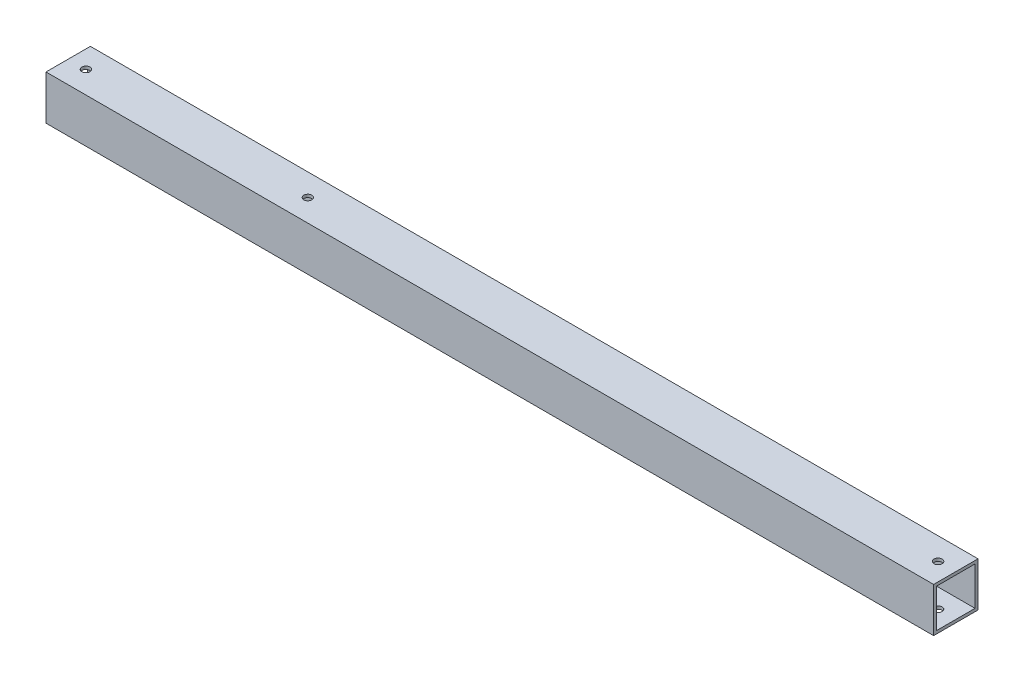
ISO-10303-21;
HEADER;
FILE_DESCRIPTION(('STEP AP214'),'2;1');
FILE_NAME('part.step','',(''),(''),'','','');
FILE_SCHEMA(('AUTOMOTIVE_DESIGN { 1 0 10303 214 1 1 1 1 }'));
ENDSEC;
DATA;
#1=APPLICATION_CONTEXT('core data for automotive mechanical design processes');
#2=APPLICATION_PROTOCOL_DEFINITION('international standard','automotive_design',2000,#1);
#3=PRODUCT_CONTEXT('',#1,'mechanical');
#4=PRODUCT('Part','Part','',(#3));
#5=PRODUCT_RELATED_PRODUCT_CATEGORY('part','',(#4));
#6=PRODUCT_DEFINITION_FORMATION('','',#4);
#7=PRODUCT_DEFINITION_CONTEXT('part definition',#1,'design');
#8=PRODUCT_DEFINITION('design','',#6,#7);
#9=PRODUCT_DEFINITION_SHAPE('','',#8);
#10=(LENGTH_UNIT() NAMED_UNIT(*) SI_UNIT(.MILLI.,.METRE.));
#11=(NAMED_UNIT(*) PLANE_ANGLE_UNIT() SI_UNIT($,.RADIAN.));
#12=(NAMED_UNIT(*) SI_UNIT($,.STERADIAN.) SOLID_ANGLE_UNIT());
#13=UNCERTAINTY_MEASURE_WITH_UNIT(LENGTH_MEASURE(1.E-05),#10,'distance_accuracy_value','');
#14=(GEOMETRIC_REPRESENTATION_CONTEXT(3) GLOBAL_UNCERTAINTY_ASSIGNED_CONTEXT((#13)) GLOBAL_UNIT_ASSIGNED_CONTEXT((#10,
#11,#12)) REPRESENTATION_CONTEXT('',''));
#15=CARTESIAN_POINT('',(0.,0.,0.));
#16=DIRECTION('',(0.,0.,1.));
#17=DIRECTION('',(1.,0.,0.));
#18=AXIS2_PLACEMENT_3D('',#15,#16,#17);
#19=CARTESIAN_POINT('',(300.,0.,0.));
#20=DIRECTION('',(-1.,0.,0.));
#21=DIRECTION('',(0.,0.,1.));
#22=AXIS2_PLACEMENT_3D('',#19,#20,#21);
#23=PLANE('',#22);
#24=DIRECTION('',(0.,-1.,0.));
#25=VECTOR('',#24,1.);
#26=CARTESIAN_POINT('',(300.,15.,15.));
#27=LINE('',#26,#25);
#28=CARTESIAN_POINT('',(300.,15.,15.));
#29=VERTEX_POINT('',#28);
#30=CARTESIAN_POINT('',(300.,-15.,15.));
#31=VERTEX_POINT('',#30);
#32=EDGE_CURVE('E157',#29,#31,#27,.T.);
#33=ORIENTED_EDGE('',*,*,#32,.T.);
#34=DIRECTION('',(0.,0.,-1.));
#35=VECTOR('',#34,1.);
#36=CARTESIAN_POINT('',(300.,-15.,-15.));
#37=LINE('',#36,#35);
#38=CARTESIAN_POINT('',(300.,-15.,-15.));
#39=VERTEX_POINT('',#38);
#40=EDGE_CURVE('E161',#31,#39,#37,.T.);
#41=ORIENTED_EDGE('',*,*,#40,.T.);
#42=DIRECTION('',(0.,1.,0.));
#43=VECTOR('',#42,1.);
#44=CARTESIAN_POINT('',(300.,15.,-15.));
#45=LINE('',#44,#43);
#46=CARTESIAN_POINT('',(300.,15.,-15.));
#47=VERTEX_POINT('',#46);
#48=EDGE_CURVE('E165',#39,#47,#45,.T.);
#49=ORIENTED_EDGE('',*,*,#48,.T.);
#50=DIRECTION('',(0.,0.,1.));
#51=VECTOR('',#50,1.);
#52=CARTESIAN_POINT('',(300.,15.,-15.));
#53=LINE('',#52,#51);
#54=EDGE_CURVE('E168',#47,#29,#53,.T.);
#55=ORIENTED_EDGE('',*,*,#54,.T.);
#56=EDGE_LOOP('',(#33,#41,#49,#55));
#57=FACE_BOUND('',#56,.T.);
#58=DIRECTION('',(0.,1.,0.));
#59=VECTOR('',#58,1.);
#60=CARTESIAN_POINT('',(300.,13.,-13.));
#61=LINE('',#60,#59);
#62=CARTESIAN_POINT('',(300.,-13.,-13.));
#63=VERTEX_POINT('',#62);
#64=CARTESIAN_POINT('',(300.,13.,-13.));
#65=VERTEX_POINT('',#64);
#66=EDGE_CURVE('E107',#63,#65,#61,.T.);
#67=ORIENTED_EDGE('',*,*,#66,.F.);
#68=DIRECTION('',(0.,0.,-1.));
#69=VECTOR('',#68,1.);
#70=CARTESIAN_POINT('',(300.,-13.,13.));
#71=LINE('',#70,#69);
#72=CARTESIAN_POINT('',(300.,-13.,13.));
#73=VERTEX_POINT('',#72);
#74=EDGE_CURVE('E133',#73,#63,#71,.T.);
#75=ORIENTED_EDGE('',*,*,#74,.F.);
#76=DIRECTION('',(0.,-1.,0.));
#77=VECTOR('',#76,1.);
#78=CARTESIAN_POINT('',(300.,13.,13.));
#79=LINE('',#78,#77);
#80=CARTESIAN_POINT('',(300.,13.,13.));
#81=VERTEX_POINT('',#80);
#82=EDGE_CURVE('E129',#81,#73,#79,.T.);
#83=ORIENTED_EDGE('',*,*,#82,.F.);
#84=DIRECTION('',(0.,0.,1.));
#85=VECTOR('',#84,1.);
#86=CARTESIAN_POINT('',(300.,13.,13.));
#87=LINE('',#86,#85);
#88=EDGE_CURVE('E116',#65,#81,#87,.T.);
#89=ORIENTED_EDGE('',*,*,#88,.F.);
#90=EDGE_LOOP('',(#67,#75,#83,#89));
#91=FACE_BOUND('',#90,.T.);
#92=ADVANCED_FACE('F39',(#57,#91),#23,.F.);
#93=CARTESIAN_POINT('',(-300.,0.,0.));
#94=DIRECTION('',(-1.,0.,0.));
#95=DIRECTION('',(0.,0.,1.));
#96=AXIS2_PLACEMENT_3D('',#93,#94,#95);
#97=PLANE('',#96);
#98=DIRECTION('',(0.,-1.,0.));
#99=VECTOR('',#98,1.);
#100=CARTESIAN_POINT('',(-300.,15.,15.));
#101=LINE('',#100,#99);
#102=CARTESIAN_POINT('',(-300.,15.,15.));
#103=VERTEX_POINT('',#102);
#104=CARTESIAN_POINT('',(-300.,-15.,15.));
#105=VERTEX_POINT('',#104);
#106=EDGE_CURVE('E125',#103,#105,#101,.T.);
#107=ORIENTED_EDGE('',*,*,#106,.F.);
#108=DIRECTION('',(0.,0.,1.));
#109=VECTOR('',#108,1.);
#110=CARTESIAN_POINT('',(-300.,15.,-15.));
#111=LINE('',#110,#109);
#112=CARTESIAN_POINT('',(-300.,15.,-15.));
#113=VERTEX_POINT('',#112);
#114=EDGE_CURVE('E162',#113,#103,#111,.T.);
#115=ORIENTED_EDGE('',*,*,#114,.F.);
#116=DIRECTION('',(0.,1.,0.));
#117=VECTOR('',#116,1.);
#118=CARTESIAN_POINT('',(-300.,15.,-15.));
#119=LINE('',#118,#117);
#120=CARTESIAN_POINT('',(-300.,-15.,-15.));
#121=VERTEX_POINT('',#120);
#122=EDGE_CURVE('E178',#121,#113,#119,.T.);
#123=ORIENTED_EDGE('',*,*,#122,.F.);
#124=DIRECTION('',(0.,0.,-1.));
#125=VECTOR('',#124,1.);
#126=CARTESIAN_POINT('',(-300.,-15.,-15.));
#127=LINE('',#126,#125);
#128=EDGE_CURVE('E175',#105,#121,#127,.T.);
#129=ORIENTED_EDGE('',*,*,#128,.F.);
#130=EDGE_LOOP('',(#107,#115,#123,#129));
#131=FACE_BOUND('',#130,.T.);
#132=DIRECTION('',(0.,0.,-1.));
#133=VECTOR('',#132,1.);
#134=CARTESIAN_POINT('',(-300.,-13.,13.));
#135=LINE('',#134,#133);
#136=CARTESIAN_POINT('',(-300.,-13.,13.));
#137=VERTEX_POINT('',#136);
#138=CARTESIAN_POINT('',(-300.,-13.,-13.));
#139=VERTEX_POINT('',#138);
#140=EDGE_CURVE('E117',#137,#139,#135,.T.);
#141=ORIENTED_EDGE('',*,*,#140,.T.);
#142=DIRECTION('',(0.,1.,0.));
#143=VECTOR('',#142,1.);
#144=CARTESIAN_POINT('',(-300.,13.,-13.));
#145=LINE('',#144,#143);
#146=CARTESIAN_POINT('',(-300.,13.,-13.));
#147=VERTEX_POINT('',#146);
#148=EDGE_CURVE('E65',#139,#147,#145,.T.);
#149=ORIENTED_EDGE('',*,*,#148,.T.);
#150=DIRECTION('',(0.,0.,1.));
#151=VECTOR('',#150,1.);
#152=CARTESIAN_POINT('',(-300.,13.,13.));
#153=LINE('',#152,#151);
#154=CARTESIAN_POINT('',(-300.,13.,13.));
#155=VERTEX_POINT('',#154);
#156=EDGE_CURVE('E123',#147,#155,#153,.T.);
#157=ORIENTED_EDGE('',*,*,#156,.T.);
#158=DIRECTION('',(0.,-1.,0.));
#159=VECTOR('',#158,1.);
#160=CARTESIAN_POINT('',(-300.,13.,13.));
#161=LINE('',#160,#159);
#162=EDGE_CURVE('E144',#155,#137,#161,.T.);
#163=ORIENTED_EDGE('',*,*,#162,.T.);
#164=EDGE_LOOP('',(#141,#149,#157,#163));
#165=FACE_BOUND('',#164,.T.);
#166=ADVANCED_FACE('F248',(#131,#165),#97,.T.);
#167=CARTESIAN_POINT('',(300.,15.,15.));
#168=DIRECTION('',(0.,0.,-1.));
#169=DIRECTION('',(0.,1.,0.));
#170=AXIS2_PLACEMENT_3D('',#167,#168,#169);
#171=PLANE('',#170);
#172=ORIENTED_EDGE('',*,*,#106,.T.);
#173=DIRECTION('',(-1.,0.,0.));
#174=VECTOR('',#173,1.);
#175=CARTESIAN_POINT('',(300.,-15.,15.));
#176=LINE('',#175,#174);
#177=EDGE_CURVE('E11',#31,#105,#176,.T.);
#178=ORIENTED_EDGE('',*,*,#177,.F.);
#179=ORIENTED_EDGE('',*,*,#32,.F.);
#180=DIRECTION('',(-1.,0.,0.));
#181=VECTOR('',#180,1.);
#182=CARTESIAN_POINT('',(300.,15.,15.));
#183=LINE('',#182,#181);
#184=EDGE_CURVE('E171',#29,#103,#183,.T.);
#185=ORIENTED_EDGE('',*,*,#184,.T.);
#186=EDGE_LOOP('',(#172,#178,#179,#185));
#187=FACE_BOUND('',#186,.T.);
#188=ADVANCED_FACE('F41',(#187),#171,.F.);
#189=CARTESIAN_POINT('',(300.,-15.,-15.));
#190=DIRECTION('',(0.,1.,0.));
#191=DIRECTION('',(0.,0.,1.));
#192=AXIS2_PLACEMENT_3D('',#189,#190,#191);
#193=PLANE('',#192);
#194=CARTESIAN_POINT('',(-138.,-15.,0.));
#195=DIRECTION('',(0.,1.,0.));
#196=DIRECTION('',(0.,0.,1.));
#197=AXIS2_PLACEMENT_3D('',#194,#195,#196);
#198=CIRCLE('',#197,2.75000000000001);
#199=CARTESIAN_POINT('',(-138.,-15.,2.75000000000001));
#200=VERTEX_POINT('',#199);
#201=EDGE_CURVE('E273',#200,#200,#198,.T.);
#202=ORIENTED_EDGE('',*,*,#201,.T.);
#203=EDGE_LOOP('',(#202));
#204=FACE_BOUND('',#203,.T.);
#205=CARTESIAN_POINT('',(-288.,-15.,0.));
#206=DIRECTION('',(0.,-1.,0.));
#207=DIRECTION('',(0.,0.,1.));
#208=AXIS2_PLACEMENT_3D('',#205,#206,#207);
#209=CIRCLE('',#208,2.75000000000004);
#210=CARTESIAN_POINT('',(-288.,-15.,2.75000000000004));
#211=VERTEX_POINT('',#210);
#212=EDGE_CURVE('E201',#211,#211,#209,.T.);
#213=ORIENTED_EDGE('',*,*,#212,.F.);
#214=EDGE_LOOP('',(#213));
#215=FACE_BOUND('',#214,.T.);
#216=CARTESIAN_POINT('',(288.,-15.,0.));
#217=DIRECTION('',(0.,1.,0.));
#218=DIRECTION('',(0.,0.,1.));
#219=AXIS2_PLACEMENT_3D('',#216,#217,#218);
#220=CIRCLE('',#219,2.75000000000004);
#221=CARTESIAN_POINT('',(288.,-15.,2.75000000000004));
#222=VERTEX_POINT('',#221);
#223=EDGE_CURVE('E196',#222,#222,#220,.T.);
#224=ORIENTED_EDGE('',*,*,#223,.T.);
#225=EDGE_LOOP('',(#224));
#226=FACE_BOUND('',#225,.T.);
#227=ORIENTED_EDGE('',*,*,#128,.T.);
#228=DIRECTION('',(-1.,0.,0.));
#229=VECTOR('',#228,1.);
#230=CARTESIAN_POINT('',(300.,-15.,-15.));
#231=LINE('',#230,#229);
#232=EDGE_CURVE('E49',#39,#121,#231,.T.);
#233=ORIENTED_EDGE('',*,*,#232,.F.);
#234=ORIENTED_EDGE('',*,*,#40,.F.);
#235=ORIENTED_EDGE('',*,*,#177,.T.);
#236=EDGE_LOOP('',(#227,#233,#234,#235));
#237=FACE_BOUND('',#236,.T.);
#238=ADVANCED_FACE('F262',(#204,#215,#226,#237),#193,.F.);
#239=CARTESIAN_POINT('',(300.,15.,-15.));
#240=DIRECTION('',(0.,0.,1.));
#241=DIRECTION('',(0.,-1.,0.));
#242=AXIS2_PLACEMENT_3D('',#239,#240,#241);
#243=PLANE('',#242);
#244=ORIENTED_EDGE('',*,*,#122,.T.);
#245=DIRECTION('',(-1.,0.,0.));
#246=VECTOR('',#245,1.);
#247=CARTESIAN_POINT('',(300.,15.,-15.));
#248=LINE('',#247,#246);
#249=EDGE_CURVE('E186',#47,#113,#248,.T.);
#250=ORIENTED_EDGE('',*,*,#249,.F.);
#251=ORIENTED_EDGE('',*,*,#48,.F.);
#252=ORIENTED_EDGE('',*,*,#232,.T.);
#253=EDGE_LOOP('',(#244,#250,#251,#252));
#254=FACE_BOUND('',#253,.T.);
#255=ADVANCED_FACE('F259',(#254),#243,.F.);
#256=CARTESIAN_POINT('',(300.,15.,-15.));
#257=DIRECTION('',(0.,-1.,0.));
#258=DIRECTION('',(0.,0.,-1.));
#259=AXIS2_PLACEMENT_3D('',#256,#257,#258);
#260=PLANE('',#259);
#261=CARTESIAN_POINT('',(-138.,15.,0.));
#262=DIRECTION('',(0.,1.,0.));
#263=DIRECTION('',(0.,0.,1.));
#264=AXIS2_PLACEMENT_3D('',#261,#262,#263);
#265=CIRCLE('',#264,2.75000000000001);
#266=CARTESIAN_POINT('',(-138.,15.,2.75000000000001));
#267=VERTEX_POINT('',#266);
#268=EDGE_CURVE('E319',#267,#267,#265,.T.);
#269=ORIENTED_EDGE('',*,*,#268,.F.);
#270=EDGE_LOOP('',(#269));
#271=FACE_BOUND('',#270,.T.);
#272=CARTESIAN_POINT('',(-288.,15.,0.));
#273=DIRECTION('',(0.,-1.,0.));
#274=DIRECTION('',(0.,0.,1.));
#275=AXIS2_PLACEMENT_3D('',#272,#273,#274);
#276=CIRCLE('',#275,2.75000000000004);
#277=CARTESIAN_POINT('',(-288.,15.,2.75000000000004));
#278=VERTEX_POINT('',#277);
#279=EDGE_CURVE('E210',#278,#278,#276,.T.);
#280=ORIENTED_EDGE('',*,*,#279,.T.);
#281=EDGE_LOOP('',(#280));
#282=FACE_BOUND('',#281,.T.);
#283=CARTESIAN_POINT('',(288.,15.,0.));
#284=DIRECTION('',(0.,1.,0.));
#285=DIRECTION('',(0.,0.,1.));
#286=AXIS2_PLACEMENT_3D('',#283,#284,#285);
#287=CIRCLE('',#286,2.75000000000004);
#288=CARTESIAN_POINT('',(288.,15.,2.75000000000004));
#289=VERTEX_POINT('',#288);
#290=EDGE_CURVE('E207',#289,#289,#287,.T.);
#291=ORIENTED_EDGE('',*,*,#290,.F.);
#292=EDGE_LOOP('',(#291));
#293=FACE_BOUND('',#292,.T.);
#294=ORIENTED_EDGE('',*,*,#114,.T.);
#295=ORIENTED_EDGE('',*,*,#184,.F.);
#296=ORIENTED_EDGE('',*,*,#54,.F.);
#297=ORIENTED_EDGE('',*,*,#249,.T.);
#298=EDGE_LOOP('',(#294,#295,#296,#297));
#299=FACE_BOUND('',#298,.T.);
#300=ADVANCED_FACE('F243',(#271,#282,#293,#299),#260,.F.);
#301=CARTESIAN_POINT('',(300.,13.,-13.));
#302=DIRECTION('',(0.,0.,1.));
#303=DIRECTION('',(1.,0.,0.));
#304=AXIS2_PLACEMENT_3D('',#301,#302,#303);
#305=PLANE('',#304);
#306=ORIENTED_EDGE('',*,*,#148,.F.);
#307=DIRECTION('',(-1.,0.,0.));
#308=VECTOR('',#307,1.);
#309=CARTESIAN_POINT('',(300.,-13.,-13.));
#310=LINE('',#309,#308);
#311=EDGE_CURVE('E111',#63,#139,#310,.T.);
#312=ORIENTED_EDGE('',*,*,#311,.F.);
#313=ORIENTED_EDGE('',*,*,#66,.T.);
#314=DIRECTION('',(-1.,0.,0.));
#315=VECTOR('',#314,1.);
#316=CARTESIAN_POINT('',(300.,13.,-13.));
#317=LINE('',#316,#315);
#318=EDGE_CURVE('E110',#65,#147,#317,.T.);
#319=ORIENTED_EDGE('',*,*,#318,.T.);
#320=EDGE_LOOP('',(#306,#312,#313,#319));
#321=FACE_BOUND('',#320,.T.);
#322=ADVANCED_FACE('F109',(#321),#305,.T.);
#323=CARTESIAN_POINT('',(300.,13.,13.));
#324=DIRECTION('',(0.,-1.,0.));
#325=DIRECTION('',(0.,0.,-1.));
#326=AXIS2_PLACEMENT_3D('',#323,#324,#325);
#327=PLANE('',#326);
#328=CARTESIAN_POINT('',(-138.,13.,0.));
#329=DIRECTION('',(0.,-1.,0.));
#330=DIRECTION('',(0.,0.,-1.));
#331=AXIS2_PLACEMENT_3D('',#328,#329,#330);
#332=CIRCLE('',#331,2.75000000000001);
#333=CARTESIAN_POINT('',(-138.,13.,-2.75000000000001));
#334=VERTEX_POINT('',#333);
#335=EDGE_CURVE('E216',#334,#334,#332,.T.);
#336=ORIENTED_EDGE('',*,*,#335,.F.);
#337=EDGE_LOOP('',(#336));
#338=FACE_BOUND('',#337,.T.);
#339=CARTESIAN_POINT('',(-288.,13.,0.));
#340=DIRECTION('',(0.,-1.,0.));
#341=DIRECTION('',(0.,0.,-1.));
#342=AXIS2_PLACEMENT_3D('',#339,#340,#341);
#343=CIRCLE('',#342,2.75000000000004);
#344=CARTESIAN_POINT('',(-288.,13.,-2.75000000000004));
#345=VERTEX_POINT('',#344);
#346=EDGE_CURVE('E200',#345,#345,#343,.F.);
#347=ORIENTED_EDGE('',*,*,#346,.T.);
#348=EDGE_LOOP('',(#347));
#349=FACE_BOUND('',#348,.T.);
#350=CARTESIAN_POINT('',(288.,13.,0.));
#351=DIRECTION('',(0.,-1.,0.));
#352=DIRECTION('',(0.,0.,-1.));
#353=AXIS2_PLACEMENT_3D('',#350,#351,#352);
#354=CIRCLE('',#353,2.75000000000004);
#355=CARTESIAN_POINT('',(288.,13.,-2.75000000000004));
#356=VERTEX_POINT('',#355);
#357=EDGE_CURVE('E141',#356,#356,#354,.T.);
#358=ORIENTED_EDGE('',*,*,#357,.F.);
#359=EDGE_LOOP('',(#358));
#360=FACE_BOUND('',#359,.T.);
#361=ORIENTED_EDGE('',*,*,#156,.F.);
#362=ORIENTED_EDGE('',*,*,#318,.F.);
#363=ORIENTED_EDGE('',*,*,#88,.T.);
#364=DIRECTION('',(-1.,0.,0.));
#365=VECTOR('',#364,1.);
#366=CARTESIAN_POINT('',(300.,13.,13.));
#367=LINE('',#366,#365);
#368=EDGE_CURVE('E126',#81,#155,#367,.T.);
#369=ORIENTED_EDGE('',*,*,#368,.T.);
#370=EDGE_LOOP('',(#361,#362,#363,#369));
#371=FACE_BOUND('',#370,.T.);
#372=ADVANCED_FACE('F120',(#338,#349,#360,#371),#327,.T.);
#373=CARTESIAN_POINT('',(300.,13.,13.));
#374=DIRECTION('',(0.,0.,-1.));
#375=DIRECTION('',(-1.,0.,0.));
#376=AXIS2_PLACEMENT_3D('',#373,#374,#375);
#377=PLANE('',#376);
#378=ORIENTED_EDGE('',*,*,#162,.F.);
#379=ORIENTED_EDGE('',*,*,#368,.F.);
#380=ORIENTED_EDGE('',*,*,#82,.T.);
#381=DIRECTION('',(-1.,0.,0.));
#382=VECTOR('',#381,1.);
#383=CARTESIAN_POINT('',(300.,-13.,13.));
#384=LINE('',#383,#382);
#385=EDGE_CURVE('E57',#73,#137,#384,.T.);
#386=ORIENTED_EDGE('',*,*,#385,.T.);
#387=EDGE_LOOP('',(#378,#379,#380,#386));
#388=FACE_BOUND('',#387,.T.);
#389=ADVANCED_FACE('F233',(#388),#377,.T.);
#390=CARTESIAN_POINT('',(300.,-13.,13.));
#391=DIRECTION('',(0.,1.,0.));
#392=DIRECTION('',(0.,0.,1.));
#393=AXIS2_PLACEMENT_3D('',#390,#391,#392);
#394=PLANE('',#393);
#395=CARTESIAN_POINT('',(-138.,-13.,0.));
#396=DIRECTION('',(0.,1.,0.));
#397=DIRECTION('',(0.,0.,1.));
#398=AXIS2_PLACEMENT_3D('',#395,#396,#397);
#399=CIRCLE('',#398,2.75000000000001);
#400=CARTESIAN_POINT('',(-138.,-13.,2.75000000000001));
#401=VERTEX_POINT('',#400);
#402=EDGE_CURVE('E43',#401,#401,#399,.T.);
#403=ORIENTED_EDGE('',*,*,#402,.F.);
#404=EDGE_LOOP('',(#403));
#405=FACE_BOUND('',#404,.T.);
#406=CARTESIAN_POINT('',(-288.,-13.,0.));
#407=DIRECTION('',(0.,1.,0.));
#408=DIRECTION('',(0.,0.,1.));
#409=AXIS2_PLACEMENT_3D('',#406,#407,#408);
#410=CIRCLE('',#409,2.75000000000004);
#411=CARTESIAN_POINT('',(-288.,-13.,2.75000000000004));
#412=VERTEX_POINT('',#411);
#413=EDGE_CURVE('E197',#412,#412,#410,.F.);
#414=ORIENTED_EDGE('',*,*,#413,.T.);
#415=EDGE_LOOP('',(#414));
#416=FACE_BOUND('',#415,.T.);
#417=CARTESIAN_POINT('',(288.,-13.,0.));
#418=DIRECTION('',(0.,1.,0.));
#419=DIRECTION('',(0.,0.,1.));
#420=AXIS2_PLACEMENT_3D('',#417,#418,#419);
#421=CIRCLE('',#420,2.75000000000004);
#422=CARTESIAN_POINT('',(288.,-13.,2.75000000000004));
#423=VERTEX_POINT('',#422);
#424=EDGE_CURVE('E193',#423,#423,#421,.T.);
#425=ORIENTED_EDGE('',*,*,#424,.F.);
#426=EDGE_LOOP('',(#425));
#427=FACE_BOUND('',#426,.T.);
#428=ORIENTED_EDGE('',*,*,#140,.F.);
#429=ORIENTED_EDGE('',*,*,#385,.F.);
#430=ORIENTED_EDGE('',*,*,#74,.T.);
#431=ORIENTED_EDGE('',*,*,#311,.T.);
#432=EDGE_LOOP('',(#428,#429,#430,#431));
#433=FACE_BOUND('',#432,.T.);
#434=ADVANCED_FACE('F240',(#405,#416,#427,#433),#394,.T.);
#435=CARTESIAN_POINT('',(288.,-15.,0.));
#436=DIRECTION('',(0.,1.,0.));
#437=DIRECTION('',(0.,0.,1.));
#438=AXIS2_PLACEMENT_3D('',#435,#436,#437);
#439=CYLINDRICAL_SURFACE('',#438,2.75000000000004);
#440=ORIENTED_EDGE('',*,*,#424,.T.);
#441=EDGE_LOOP('',(#440));
#442=FACE_BOUND('',#441,.T.);
#443=ORIENTED_EDGE('',*,*,#223,.F.);
#444=EDGE_LOOP('',(#443));
#445=FACE_BOUND('',#444,.T.);
#446=ADVANCED_FACE('F291',(#442,#445),#439,.F.);
#447=ORIENTED_EDGE('',*,*,#357,.T.);
#448=EDGE_LOOP('',(#447));
#449=FACE_BOUND('',#448,.T.);
#450=ORIENTED_EDGE('',*,*,#290,.T.);
#451=EDGE_LOOP('',(#450));
#452=FACE_BOUND('',#451,.T.);
#453=ADVANCED_FACE('F229',(#449,#452),#439,.F.);
#454=CARTESIAN_POINT('',(-288.,-15.,0.));
#455=DIRECTION('',(0.,1.,0.));
#456=DIRECTION('',(0.,0.,1.));
#457=AXIS2_PLACEMENT_3D('',#454,#455,#456);
#458=CYLINDRICAL_SURFACE('',#457,2.75000000000004);
#459=ORIENTED_EDGE('',*,*,#413,.F.);
#460=EDGE_LOOP('',(#459));
#461=FACE_BOUND('',#460,.T.);
#462=ORIENTED_EDGE('',*,*,#212,.T.);
#463=EDGE_LOOP('',(#462));
#464=FACE_BOUND('',#463,.T.);
#465=ADVANCED_FACE('F301',(#461,#464),#458,.F.);
#466=ORIENTED_EDGE('',*,*,#346,.F.);
#467=EDGE_LOOP('',(#466));
#468=FACE_BOUND('',#467,.T.);
#469=ORIENTED_EDGE('',*,*,#279,.F.);
#470=EDGE_LOOP('',(#469));
#471=FACE_BOUND('',#470,.T.);
#472=ADVANCED_FACE('F304',(#468,#471),#458,.F.);
#473=CARTESIAN_POINT('',(-138.,-15.,0.));
#474=DIRECTION('',(0.,1.,0.));
#475=DIRECTION('',(0.,0.,1.));
#476=AXIS2_PLACEMENT_3D('',#473,#474,#475);
#477=CYLINDRICAL_SURFACE('',#476,2.75000000000001);
#478=ORIENTED_EDGE('',*,*,#402,.T.);
#479=EDGE_LOOP('',(#478));
#480=FACE_BOUND('',#479,.T.);
#481=ORIENTED_EDGE('',*,*,#201,.F.);
#482=EDGE_LOOP('',(#481));
#483=FACE_BOUND('',#482,.T.);
#484=ADVANCED_FACE('F306',(#480,#483),#477,.F.);
#485=ORIENTED_EDGE('',*,*,#335,.T.);
#486=EDGE_LOOP('',(#485));
#487=FACE_BOUND('',#486,.T.);
#488=ORIENTED_EDGE('',*,*,#268,.T.);
#489=EDGE_LOOP('',(#488));
#490=FACE_BOUND('',#489,.T.);
#491=ADVANCED_FACE('F308',(#487,#490),#477,.F.);
#492=CLOSED_SHELL('',(#92,#166,#188,#238,#255,#300,#322,#372,#389,#434,#446,#453,#465,#472,#484,#491));
#493=MANIFOLD_SOLID_BREP('B2',#492);
#494=ADVANCED_BREP_SHAPE_REPRESENTATION('',(#18,#493),#14);
#495=SHAPE_DEFINITION_REPRESENTATION(#9,#494);
ENDSEC;
END-ISO-10303-21;
